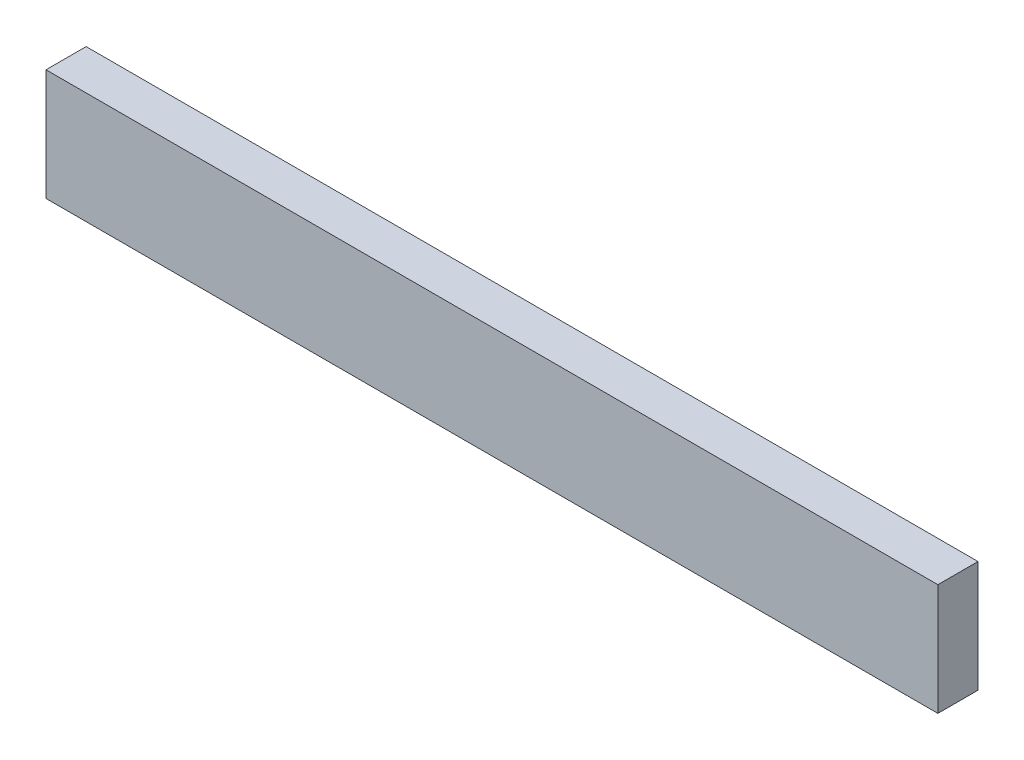
ISO-10303-21;
HEADER;
FILE_DESCRIPTION(('STEP AP214'),'2;1');
FILE_NAME('part.step','',(''),(''),'','','');
FILE_SCHEMA(('AUTOMOTIVE_DESIGN { 1 0 10303 214 1 1 1 1 }'));
ENDSEC;
DATA;
#1=APPLICATION_CONTEXT('core data for automotive mechanical design processes');
#2=APPLICATION_PROTOCOL_DEFINITION('international standard','automotive_design',2000,#1);
#3=PRODUCT_CONTEXT('',#1,'mechanical');
#4=PRODUCT('Part','Part','',(#3));
#5=PRODUCT_RELATED_PRODUCT_CATEGORY('part','',(#4));
#6=PRODUCT_DEFINITION_FORMATION('','',#4);
#7=PRODUCT_DEFINITION_CONTEXT('part definition',#1,'design');
#8=PRODUCT_DEFINITION('design','',#6,#7);
#9=PRODUCT_DEFINITION_SHAPE('','',#8);
#10=(LENGTH_UNIT() NAMED_UNIT(*) SI_UNIT(.MILLI.,.METRE.));
#11=(NAMED_UNIT(*) PLANE_ANGLE_UNIT() SI_UNIT($,.RADIAN.));
#12=(NAMED_UNIT(*) SI_UNIT($,.STERADIAN.) SOLID_ANGLE_UNIT());
#13=UNCERTAINTY_MEASURE_WITH_UNIT(LENGTH_MEASURE(1.E-05),#10,'distance_accuracy_value','');
#14=(GEOMETRIC_REPRESENTATION_CONTEXT(3) GLOBAL_UNCERTAINTY_ASSIGNED_CONTEXT((#13)) GLOBAL_UNIT_ASSIGNED_CONTEXT((#10,
#11,#12)) REPRESENTATION_CONTEXT('',''));
#15=CARTESIAN_POINT('',(0.,0.,0.));
#16=DIRECTION('',(0.,0.,1.));
#17=DIRECTION('',(1.,0.,0.));
#18=AXIS2_PLACEMENT_3D('',#15,#16,#17);
#19=CARTESIAN_POINT('',(0.,0.,18.));
#20=DIRECTION('',(1.,0.,0.));
#21=DIRECTION('',(0.,0.,-1.));
#22=AXIS2_PLACEMENT_3D('',#19,#20,#21);
#23=PLANE('',#22);
#24=DIRECTION('',(0.,-1.,0.));
#25=VECTOR('',#24,1.);
#26=CARTESIAN_POINT('',(0.,0.,0.));
#27=LINE('',#26,#25);
#28=CARTESIAN_POINT('',(0.,50.,0.));
#29=VERTEX_POINT('',#28);
#30=CARTESIAN_POINT('',(0.,0.,0.));
#31=VERTEX_POINT('',#30);
#32=EDGE_CURVE('E98',#29,#31,#27,.T.);
#33=ORIENTED_EDGE('',*,*,#32,.T.);
#34=DIRECTION('',(0.,0.,-1.));
#35=VECTOR('',#34,1.);
#36=CARTESIAN_POINT('',(0.,0.,18.));
#37=LINE('',#36,#35);
#38=CARTESIAN_POINT('',(0.,0.,18.));
#39=VERTEX_POINT('',#38);
#40=EDGE_CURVE('E11',#39,#31,#37,.T.);
#41=ORIENTED_EDGE('',*,*,#40,.F.);
#42=DIRECTION('',(0.,-1.,0.));
#43=VECTOR('',#42,1.);
#44=CARTESIAN_POINT('',(0.,0.,18.));
#45=LINE('',#44,#43);
#46=CARTESIAN_POINT('',(0.,50.,18.));
#47=VERTEX_POINT('',#46);
#48=EDGE_CURVE('E86',#47,#39,#45,.T.);
#49=ORIENTED_EDGE('',*,*,#48,.F.);
#50=DIRECTION('',(0.,0.,-1.));
#51=VECTOR('',#50,1.);
#52=CARTESIAN_POINT('',(0.,50.,18.));
#53=LINE('',#52,#51);
#54=EDGE_CURVE('E94',#47,#29,#53,.T.);
#55=ORIENTED_EDGE('',*,*,#54,.T.);
#56=EDGE_LOOP('',(#33,#41,#49,#55));
#57=FACE_BOUND('',#56,.T.);
#58=ADVANCED_FACE('F35',(#57),#23,.F.);
#59=CARTESIAN_POINT('',(0.,0.,18.));
#60=DIRECTION('',(0.,1.,0.));
#61=DIRECTION('',(0.,0.,1.));
#62=AXIS2_PLACEMENT_3D('',#59,#60,#61);
#63=PLANE('',#62);
#64=DIRECTION('',(1.,0.,0.));
#65=VECTOR('',#64,1.);
#66=CARTESIAN_POINT('',(0.,0.,0.));
#67=LINE('',#66,#65);
#68=CARTESIAN_POINT('',(400.,0.,0.));
#69=VERTEX_POINT('',#68);
#70=EDGE_CURVE('E90',#31,#69,#67,.T.);
#71=ORIENTED_EDGE('',*,*,#70,.T.);
#72=DIRECTION('',(0.,0.,-1.));
#73=VECTOR('',#72,1.);
#74=CARTESIAN_POINT('',(400.,0.,18.));
#75=LINE('',#74,#73);
#76=CARTESIAN_POINT('',(400.,0.,18.));
#77=VERTEX_POINT('',#76);
#78=EDGE_CURVE('E43',#77,#69,#75,.T.);
#79=ORIENTED_EDGE('',*,*,#78,.F.);
#80=DIRECTION('',(1.,0.,0.));
#81=VECTOR('',#80,1.);
#82=CARTESIAN_POINT('',(0.,0.,18.));
#83=LINE('',#82,#81);
#84=EDGE_CURVE('E81',#39,#77,#83,.T.);
#85=ORIENTED_EDGE('',*,*,#84,.F.);
#86=ORIENTED_EDGE('',*,*,#40,.T.);
#87=EDGE_LOOP('',(#71,#79,#85,#86));
#88=FACE_BOUND('',#87,.T.);
#89=ADVANCED_FACE('F89',(#88),#63,.F.);
#90=CARTESIAN_POINT('',(400.,0.,18.));
#91=DIRECTION('',(-1.,0.,0.));
#92=DIRECTION('',(0.,0.,1.));
#93=AXIS2_PLACEMENT_3D('',#90,#91,#92);
#94=PLANE('',#93);
#95=DIRECTION('',(0.,1.,0.));
#96=VECTOR('',#95,1.);
#97=CARTESIAN_POINT('',(400.,0.,0.));
#98=LINE('',#97,#96);
#99=CARTESIAN_POINT('',(400.,50.,0.));
#100=VERTEX_POINT('',#99);
#101=EDGE_CURVE('E68',#69,#100,#98,.T.);
#102=ORIENTED_EDGE('',*,*,#101,.T.);
#103=DIRECTION('',(0.,0.,-1.));
#104=VECTOR('',#103,1.);
#105=CARTESIAN_POINT('',(400.,50.,18.));
#106=LINE('',#105,#104);
#107=CARTESIAN_POINT('',(400.,50.,18.));
#108=VERTEX_POINT('',#107);
#109=EDGE_CURVE('E91',#108,#100,#106,.T.);
#110=ORIENTED_EDGE('',*,*,#109,.F.);
#111=DIRECTION('',(0.,1.,0.));
#112=VECTOR('',#111,1.);
#113=CARTESIAN_POINT('',(400.,0.,18.));
#114=LINE('',#113,#112);
#115=EDGE_CURVE('E84',#77,#108,#114,.T.);
#116=ORIENTED_EDGE('',*,*,#115,.F.);
#117=ORIENTED_EDGE('',*,*,#78,.T.);
#118=EDGE_LOOP('',(#102,#110,#116,#117));
#119=FACE_BOUND('',#118,.T.);
#120=ADVANCED_FACE('F92',(#119),#94,.F.);
#121=CARTESIAN_POINT('',(0.,50.,18.));
#122=DIRECTION('',(0.,-1.,0.));
#123=DIRECTION('',(0.,0.,-1.));
#124=AXIS2_PLACEMENT_3D('',#121,#122,#123);
#125=PLANE('',#124);
#126=DIRECTION('',(-1.,0.,0.));
#127=VECTOR('',#126,1.);
#128=CARTESIAN_POINT('',(0.,50.,0.));
#129=LINE('',#128,#127);
#130=EDGE_CURVE('E74',#100,#29,#129,.T.);
#131=ORIENTED_EDGE('',*,*,#130,.T.);
#132=ORIENTED_EDGE('',*,*,#54,.F.);
#133=DIRECTION('',(-1.,0.,0.));
#134=VECTOR('',#133,1.);
#135=CARTESIAN_POINT('',(0.,50.,18.));
#136=LINE('',#135,#134);
#137=EDGE_CURVE('E51',#108,#47,#136,.T.);
#138=ORIENTED_EDGE('',*,*,#137,.F.);
#139=ORIENTED_EDGE('',*,*,#109,.T.);
#140=EDGE_LOOP('',(#131,#132,#138,#139));
#141=FACE_BOUND('',#140,.T.);
#142=ADVANCED_FACE('F105',(#141),#125,.F.);
#143=CARTESIAN_POINT('',(0.,0.,18.));
#144=DIRECTION('',(0.,0.,-1.));
#145=DIRECTION('',(-1.,0.,0.));
#146=AXIS2_PLACEMENT_3D('',#143,#144,#145);
#147=PLANE('',#146);
#148=ORIENTED_EDGE('',*,*,#48,.T.);
#149=ORIENTED_EDGE('',*,*,#84,.T.);
#150=ORIENTED_EDGE('',*,*,#115,.T.);
#151=ORIENTED_EDGE('',*,*,#137,.T.);
#152=EDGE_LOOP('',(#148,#149,#150,#151));
#153=FACE_BOUND('',#152,.T.);
#154=ADVANCED_FACE('F82',(#153),#147,.F.);
#155=CARTESIAN_POINT('',(0.,0.,0.));
#156=DIRECTION('',(0.,0.,-1.));
#157=DIRECTION('',(-1.,0.,0.));
#158=AXIS2_PLACEMENT_3D('',#155,#156,#157);
#159=PLANE('',#158);
#160=ORIENTED_EDGE('',*,*,#32,.F.);
#161=ORIENTED_EDGE('',*,*,#130,.F.);
#162=ORIENTED_EDGE('',*,*,#101,.F.);
#163=ORIENTED_EDGE('',*,*,#70,.F.);
#164=EDGE_LOOP('',(#160,#161,#162,#163));
#165=FACE_BOUND('',#164,.T.);
#166=ADVANCED_FACE('F108',(#165),#159,.T.);
#167=CLOSED_SHELL('',(#58,#89,#120,#142,#154,#166));
#168=MANIFOLD_SOLID_BREP('B2',#167);
#169=ADVANCED_BREP_SHAPE_REPRESENTATION('',(#18,#168),#14);
#170=SHAPE_DEFINITION_REPRESENTATION(#9,#169);
ENDSEC;
END-ISO-10303-21;
